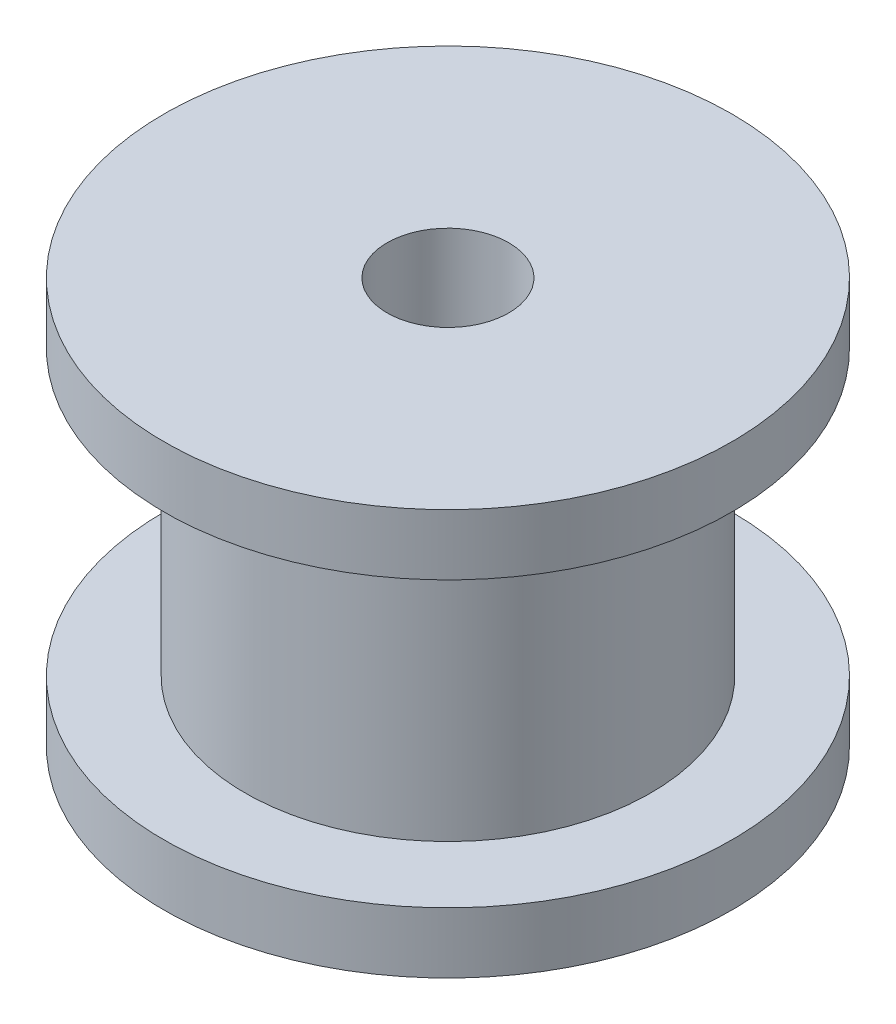
ISO-10303-21;
HEADER;
FILE_DESCRIPTION(('STEP AP214'),'2;1');
FILE_NAME('part.step','',(''),(''),'','','');
FILE_SCHEMA(('AUTOMOTIVE_DESIGN { 1 0 10303 214 1 1 1 1 }'));
ENDSEC;
DATA;
#1=APPLICATION_CONTEXT('core data for automotive mechanical design processes');
#2=APPLICATION_PROTOCOL_DEFINITION('international standard','automotive_design',2000,#1);
#3=PRODUCT_CONTEXT('',#1,'mechanical');
#4=PRODUCT('Part','Part','',(#3));
#5=PRODUCT_RELATED_PRODUCT_CATEGORY('part','',(#4));
#6=PRODUCT_DEFINITION_FORMATION('','',#4);
#7=PRODUCT_DEFINITION_CONTEXT('part definition',#1,'design');
#8=PRODUCT_DEFINITION('design','',#6,#7);
#9=PRODUCT_DEFINITION_SHAPE('','',#8);
#10=(LENGTH_UNIT() NAMED_UNIT(*) SI_UNIT(.MILLI.,.METRE.));
#11=(NAMED_UNIT(*) PLANE_ANGLE_UNIT() SI_UNIT($,.RADIAN.));
#12=(NAMED_UNIT(*) SI_UNIT($,.STERADIAN.) SOLID_ANGLE_UNIT());
#13=UNCERTAINTY_MEASURE_WITH_UNIT(LENGTH_MEASURE(1.E-05),#10,'distance_accuracy_value','');
#14=(GEOMETRIC_REPRESENTATION_CONTEXT(3) GLOBAL_UNCERTAINTY_ASSIGNED_CONTEXT((#13)) GLOBAL_UNIT_ASSIGNED_CONTEXT((#10,
#11,#12)) REPRESENTATION_CONTEXT('',''));
#15=CARTESIAN_POINT('',(0.,0.,0.));
#16=DIRECTION('',(0.,0.,1.));
#17=DIRECTION('',(1.,0.,0.));
#18=AXIS2_PLACEMENT_3D('',#15,#16,#17);
#19=CARTESIAN_POINT('',(0.,0.,0.));
#20=DIRECTION('',(0.,-1.,0.));
#21=DIRECTION('',(0.,0.,-1.));
#22=AXIS2_PLACEMENT_3D('',#19,#20,#21);
#23=CYLINDRICAL_SURFACE('',#22,1.5);
#24=CARTESIAN_POINT('',(0.,0.,0.));
#25=DIRECTION('',(0.,-1.,0.));
#26=DIRECTION('',(0.,0.,-1.));
#27=AXIS2_PLACEMENT_3D('',#24,#25,#26);
#28=CIRCLE('',#27,1.5);
#29=CARTESIAN_POINT('',(0.,0.,-1.5));
#30=VERTEX_POINT('',#29);
#31=EDGE_CURVE('E10',#30,#30,#28,.T.);
#32=ORIENTED_EDGE('',*,*,#31,.T.);
#33=EDGE_LOOP('',(#32));
#34=FACE_BOUND('',#33,.T.);
#35=CARTESIAN_POINT('',(0.,10.,0.));
#36=DIRECTION('',(0.,-1.,0.));
#37=DIRECTION('',(0.,0.,-1.));
#38=AXIS2_PLACEMENT_3D('',#35,#36,#37);
#39=CIRCLE('',#38,1.5);
#40=CARTESIAN_POINT('',(0.,10.,-1.5));
#41=VERTEX_POINT('',#40);
#42=EDGE_CURVE('E65',#41,#41,#39,.T.);
#43=ORIENTED_EDGE('',*,*,#42,.F.);
#44=EDGE_LOOP('',(#43));
#45=FACE_BOUND('',#44,.T.);
#46=ADVANCED_FACE('F37',(#34,#45),#23,.F.);
#47=CARTESIAN_POINT('',(1.5,0.,0.));
#48=DIRECTION('',(0.,-1.,0.));
#49=DIRECTION('',(0.,0.,-1.));
#50=AXIS2_PLACEMENT_3D('',#47,#48,#49);
#51=PLANE('',#50);
#52=CARTESIAN_POINT('',(0.,0.,0.));
#53=DIRECTION('',(0.,-1.,0.));
#54=DIRECTION('',(0.,0.,-1.));
#55=AXIS2_PLACEMENT_3D('',#52,#53,#54);
#56=CIRCLE('',#55,7.);
#57=CARTESIAN_POINT('',(0.,0.,-7.));
#58=VERTEX_POINT('',#57);
#59=EDGE_CURVE('E43',#58,#58,#56,.T.);
#60=ORIENTED_EDGE('',*,*,#59,.T.);
#61=EDGE_LOOP('',(#60));
#62=FACE_BOUND('',#61,.T.);
#63=ORIENTED_EDGE('',*,*,#31,.F.);
#64=EDGE_LOOP('',(#63));
#65=FACE_BOUND('',#64,.T.);
#66=ADVANCED_FACE('F72',(#62,#65),#51,.T.);
#67=CARTESIAN_POINT('',(0.,0.,0.));
#68=DIRECTION('',(0.,-1.,0.));
#69=DIRECTION('',(0.,0.,-1.));
#70=AXIS2_PLACEMENT_3D('',#67,#68,#69);
#71=CYLINDRICAL_SURFACE('',#70,7.);
#72=CARTESIAN_POINT('',(0.,1.5,0.));
#73=DIRECTION('',(0.,-1.,0.));
#74=DIRECTION('',(0.,0.,-1.));
#75=AXIS2_PLACEMENT_3D('',#72,#73,#74);
#76=CIRCLE('',#75,7.);
#77=CARTESIAN_POINT('',(0.,1.5,-7.));
#78=VERTEX_POINT('',#77);
#79=EDGE_CURVE('E47',#78,#78,#76,.T.);
#80=ORIENTED_EDGE('',*,*,#79,.T.);
#81=EDGE_LOOP('',(#80));
#82=FACE_BOUND('',#81,.T.);
#83=ORIENTED_EDGE('',*,*,#59,.F.);
#84=EDGE_LOOP('',(#83));
#85=FACE_BOUND('',#84,.T.);
#86=ADVANCED_FACE('F76',(#82,#85),#71,.T.);
#87=CARTESIAN_POINT('',(7.,1.5,0.));
#88=DIRECTION('',(0.,1.,0.));
#89=DIRECTION('',(0.,0.,1.));
#90=AXIS2_PLACEMENT_3D('',#87,#88,#89);
#91=PLANE('',#90);
#92=CARTESIAN_POINT('',(0.,1.5,0.));
#93=DIRECTION('',(0.,-1.,0.));
#94=DIRECTION('',(0.,0.,-1.));
#95=AXIS2_PLACEMENT_3D('',#92,#93,#94);
#96=CIRCLE('',#95,5.);
#97=CARTESIAN_POINT('',(0.,1.5,-5.));
#98=VERTEX_POINT('',#97);
#99=EDGE_CURVE('E51',#98,#98,#96,.T.);
#100=ORIENTED_EDGE('',*,*,#99,.T.);
#101=EDGE_LOOP('',(#100));
#102=FACE_BOUND('',#101,.T.);
#103=ORIENTED_EDGE('',*,*,#79,.F.);
#104=EDGE_LOOP('',(#103));
#105=FACE_BOUND('',#104,.T.);
#106=ADVANCED_FACE('F80',(#102,#105),#91,.T.);
#107=CARTESIAN_POINT('',(0.,0.,0.));
#108=DIRECTION('',(0.,-1.,0.));
#109=DIRECTION('',(0.,0.,-1.));
#110=AXIS2_PLACEMENT_3D('',#107,#108,#109);
#111=CYLINDRICAL_SURFACE('',#110,5.);
#112=CARTESIAN_POINT('',(0.,8.5,0.));
#113=DIRECTION('',(0.,-1.,0.));
#114=DIRECTION('',(0.,0.,-1.));
#115=AXIS2_PLACEMENT_3D('',#112,#113,#114);
#116=CIRCLE('',#115,5.);
#117=CARTESIAN_POINT('',(0.,8.5,-5.));
#118=VERTEX_POINT('',#117);
#119=EDGE_CURVE('E56',#118,#118,#116,.T.);
#120=ORIENTED_EDGE('',*,*,#119,.T.);
#121=EDGE_LOOP('',(#120));
#122=FACE_BOUND('',#121,.T.);
#123=ORIENTED_EDGE('',*,*,#99,.F.);
#124=EDGE_LOOP('',(#123));
#125=FACE_BOUND('',#124,.T.);
#126=ADVANCED_FACE('F87',(#122,#125),#111,.T.);
#127=CARTESIAN_POINT('',(5.,8.5,0.));
#128=DIRECTION('',(0.,-1.,0.));
#129=DIRECTION('',(0.,0.,-1.));
#130=AXIS2_PLACEMENT_3D('',#127,#128,#129);
#131=PLANE('',#130);
#132=CARTESIAN_POINT('',(0.,8.5,0.));
#133=DIRECTION('',(0.,-1.,0.));
#134=DIRECTION('',(0.,0.,-1.));
#135=AXIS2_PLACEMENT_3D('',#132,#133,#134);
#136=CIRCLE('',#135,7.);
#137=CARTESIAN_POINT('',(0.,8.5,-7.));
#138=VERTEX_POINT('',#137);
#139=EDGE_CURVE('E59',#138,#138,#136,.T.);
#140=ORIENTED_EDGE('',*,*,#139,.T.);
#141=EDGE_LOOP('',(#140));
#142=FACE_BOUND('',#141,.T.);
#143=ORIENTED_EDGE('',*,*,#119,.F.);
#144=EDGE_LOOP('',(#143));
#145=FACE_BOUND('',#144,.T.);
#146=ADVANCED_FACE('F91',(#142,#145),#131,.T.);
#147=CARTESIAN_POINT('',(0.,0.,0.));
#148=DIRECTION('',(0.,-1.,0.));
#149=DIRECTION('',(0.,0.,-1.));
#150=AXIS2_PLACEMENT_3D('',#147,#148,#149);
#151=CYLINDRICAL_SURFACE('',#150,7.);
#152=CARTESIAN_POINT('',(0.,10.,0.));
#153=DIRECTION('',(0.,-1.,0.));
#154=DIRECTION('',(0.,0.,-1.));
#155=AXIS2_PLACEMENT_3D('',#152,#153,#154);
#156=CIRCLE('',#155,7.);
#157=CARTESIAN_POINT('',(0.,10.,-7.));
#158=VERTEX_POINT('',#157);
#159=EDGE_CURVE('E62',#158,#158,#156,.T.);
#160=ORIENTED_EDGE('',*,*,#159,.T.);
#161=EDGE_LOOP('',(#160));
#162=FACE_BOUND('',#161,.T.);
#163=ORIENTED_EDGE('',*,*,#139,.F.);
#164=EDGE_LOOP('',(#163));
#165=FACE_BOUND('',#164,.T.);
#166=ADVANCED_FACE('F95',(#162,#165),#151,.T.);
#167=CARTESIAN_POINT('',(1.5,10.,0.));
#168=DIRECTION('',(0.,-1.,0.));
#169=DIRECTION('',(0.,0.,-1.));
#170=AXIS2_PLACEMENT_3D('',#167,#168,#169);
#171=PLANE('',#170);
#172=ORIENTED_EDGE('',*,*,#159,.F.);
#173=EDGE_LOOP('',(#172));
#174=FACE_BOUND('',#173,.T.);
#175=ORIENTED_EDGE('',*,*,#42,.T.);
#176=EDGE_LOOP('',(#175));
#177=FACE_BOUND('',#176,.T.);
#178=ADVANCED_FACE('F69',(#174,#177),#171,.F.);
#179=CLOSED_SHELL('',(#46,#66,#86,#106,#126,#146,#166,#178));
#180=MANIFOLD_SOLID_BREP('B2',#179);
#181=ADVANCED_BREP_SHAPE_REPRESENTATION('',(#18,#180),#14);
#182=SHAPE_DEFINITION_REPRESENTATION(#9,#181);
ENDSEC;
END-ISO-10303-21;
